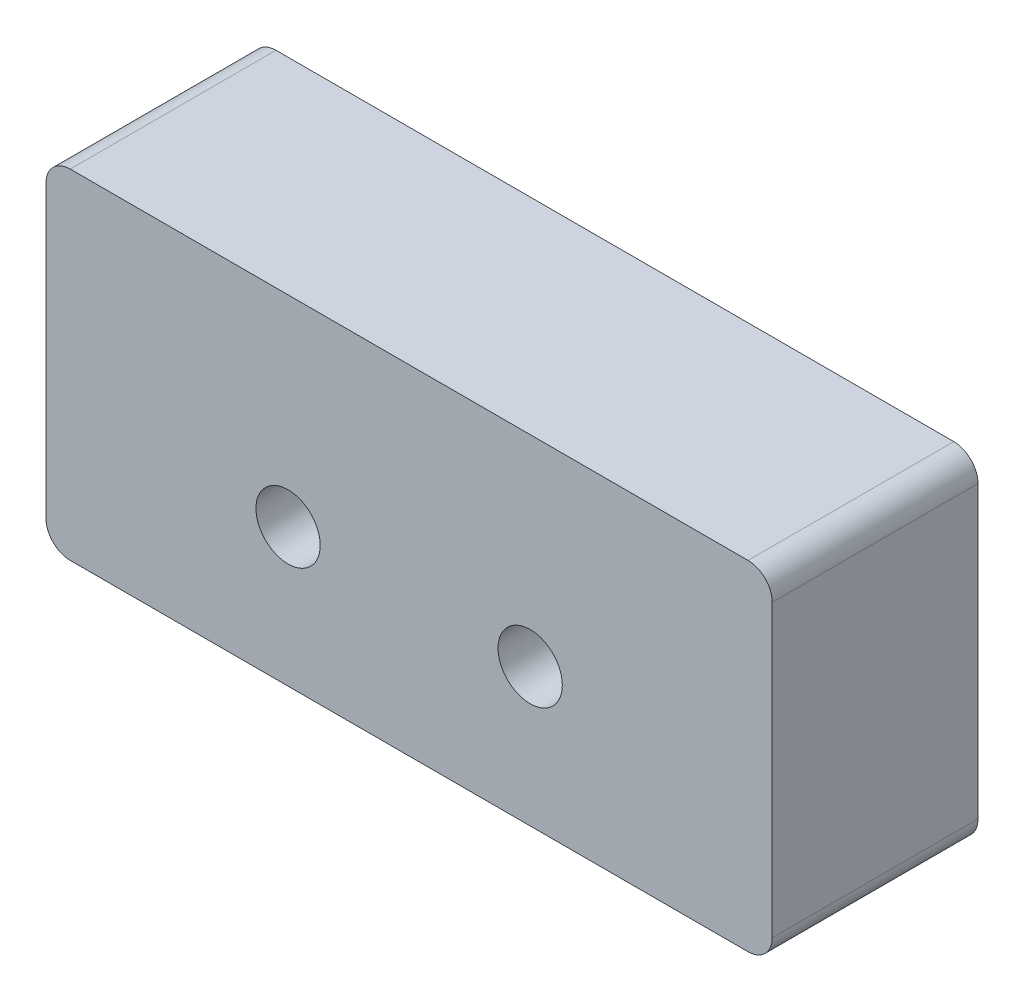
ISO-10303-21;
HEADER;
FILE_DESCRIPTION(('STEP AP214'),'2;1');
FILE_NAME('part.step','',(''),(''),'','','');
FILE_SCHEMA(('AUTOMOTIVE_DESIGN { 1 0 10303 214 1 1 1 1 }'));
ENDSEC;
DATA;
#1=APPLICATION_CONTEXT('core data for automotive mechanical design processes');
#2=APPLICATION_PROTOCOL_DEFINITION('international standard','automotive_design',2000,#1);
#3=PRODUCT_CONTEXT('',#1,'mechanical');
#4=PRODUCT('Part','Part','',(#3));
#5=PRODUCT_RELATED_PRODUCT_CATEGORY('part','',(#4));
#6=PRODUCT_DEFINITION_FORMATION('','',#4);
#7=PRODUCT_DEFINITION_CONTEXT('part definition',#1,'design');
#8=PRODUCT_DEFINITION('design','',#6,#7);
#9=PRODUCT_DEFINITION_SHAPE('','',#8);
#10=(LENGTH_UNIT() NAMED_UNIT(*) SI_UNIT(.MILLI.,.METRE.));
#11=(NAMED_UNIT(*) PLANE_ANGLE_UNIT() SI_UNIT($,.RADIAN.));
#12=(NAMED_UNIT(*) SI_UNIT($,.STERADIAN.) SOLID_ANGLE_UNIT());
#13=UNCERTAINTY_MEASURE_WITH_UNIT(LENGTH_MEASURE(1.E-05),#10,'distance_accuracy_value','');
#14=(GEOMETRIC_REPRESENTATION_CONTEXT(3) GLOBAL_UNCERTAINTY_ASSIGNED_CONTEXT((#13)) GLOBAL_UNIT_ASSIGNED_CONTEXT((#10,
#11,#12)) REPRESENTATION_CONTEXT('',''));
#15=CARTESIAN_POINT('',(0.,0.,0.));
#16=DIRECTION('',(0.,0.,1.));
#17=DIRECTION('',(1.,0.,0.));
#18=AXIS2_PLACEMENT_3D('',#15,#16,#17);
#19=CARTESIAN_POINT('',(0.,0.,21.59));
#20=DIRECTION('',(0.,0.,-1.));
#21=DIRECTION('',(-1.,0.,0.));
#22=AXIS2_PLACEMENT_3D('',#19,#20,#21);
#23=PLANE('',#22);
#24=DIRECTION('',(1.,0.,0.));
#25=VECTOR('',#24,1.);
#26=CARTESIAN_POINT('',(76.2,0.,21.59));
#27=LINE('',#26,#25);
#28=CARTESIAN_POINT('',(2.54000000000003,0.,21.59));
#29=VERTEX_POINT('',#28);
#30=CARTESIAN_POINT('',(73.66,0.,21.59));
#31=VERTEX_POINT('',#30);
#32=EDGE_CURVE('E162',#29,#31,#27,.T.);
#33=ORIENTED_EDGE('',*,*,#32,.T.);
#34=CARTESIAN_POINT('',(73.66,2.54,21.59));
#35=DIRECTION('',(0.,0.,-1.));
#36=DIRECTION('',(-1.,0.,0.));
#37=AXIS2_PLACEMENT_3D('',#34,#35,#36);
#38=CIRCLE('',#37,2.54);
#39=CARTESIAN_POINT('',(76.2,2.54,21.59));
#40=VERTEX_POINT('',#39);
#41=EDGE_CURVE('E181',#31,#40,#38,.F.);
#42=ORIENTED_EDGE('',*,*,#41,.T.);
#43=DIRECTION('',(0.,1.,0.));
#44=VECTOR('',#43,1.);
#45=CARTESIAN_POINT('',(76.2,35.56,21.59));
#46=LINE('',#45,#44);
#47=CARTESIAN_POINT('',(76.2,33.02,21.59));
#48=VERTEX_POINT('',#47);
#49=EDGE_CURVE('E137',#40,#48,#46,.T.);
#50=ORIENTED_EDGE('',*,*,#49,.T.);
#51=CARTESIAN_POINT('',(73.66,33.02,21.59));
#52=DIRECTION('',(0.,0.,-1.));
#53=DIRECTION('',(-1.,0.,0.));
#54=AXIS2_PLACEMENT_3D('',#51,#52,#53);
#55=CIRCLE('',#54,2.54);
#56=CARTESIAN_POINT('',(73.66,35.56,21.59));
#57=VERTEX_POINT('',#56);
#58=EDGE_CURVE('E176',#48,#57,#55,.F.);
#59=ORIENTED_EDGE('',*,*,#58,.T.);
#60=DIRECTION('',(-1.,0.,0.));
#61=VECTOR('',#60,1.);
#62=CARTESIAN_POINT('',(0.,35.56,21.59));
#63=LINE('',#62,#61);
#64=CARTESIAN_POINT('',(2.54,35.56,21.59));
#65=VERTEX_POINT('',#64);
#66=EDGE_CURVE('E194',#57,#65,#63,.T.);
#67=ORIENTED_EDGE('',*,*,#66,.T.);
#68=CARTESIAN_POINT('',(2.54,33.02,21.59));
#69=DIRECTION('',(0.,0.,-1.));
#70=DIRECTION('',(-1.,0.,0.));
#71=AXIS2_PLACEMENT_3D('',#68,#69,#70);
#72=CIRCLE('',#71,2.54);
#73=CARTESIAN_POINT('',(0.,33.02,21.59));
#74=VERTEX_POINT('',#73);
#75=EDGE_CURVE('E64',#65,#74,#72,.F.);
#76=ORIENTED_EDGE('',*,*,#75,.T.);
#77=DIRECTION('',(0.,-1.,0.));
#78=VECTOR('',#77,1.);
#79=CARTESIAN_POINT('',(0.,0.,21.59));
#80=LINE('',#79,#78);
#81=CARTESIAN_POINT('',(0.,2.54,21.59));
#82=VERTEX_POINT('',#81);
#83=EDGE_CURVE('E164',#74,#82,#80,.T.);
#84=ORIENTED_EDGE('',*,*,#83,.T.);
#85=CARTESIAN_POINT('',(2.54,2.54,21.59));
#86=DIRECTION('',(0.,0.,-1.));
#87=DIRECTION('',(-1.,0.,0.));
#88=AXIS2_PLACEMENT_3D('',#85,#86,#87);
#89=CIRCLE('',#88,2.54);
#90=EDGE_CURVE('E179',#82,#29,#89,.F.);
#91=ORIENTED_EDGE('',*,*,#90,.T.);
#92=EDGE_LOOP('',(#33,#42,#50,#59,#67,#76,#84,#91));
#93=FACE_BOUND('',#92,.T.);
#94=CARTESIAN_POINT('',(25.4,14.478,21.59));
#95=DIRECTION('',(0.,0.,1.));
#96=DIRECTION('',(1.,0.,0.));
#97=AXIS2_PLACEMENT_3D('',#94,#95,#96);
#98=CIRCLE('',#97,3.3734375);
#99=CARTESIAN_POINT('',(28.7734375,14.478,21.59));
#100=VERTEX_POINT('',#99);
#101=EDGE_CURVE('E156',#100,#100,#98,.T.);
#102=ORIENTED_EDGE('',*,*,#101,.F.);
#103=EDGE_LOOP('',(#102));
#104=FACE_BOUND('',#103,.T.);
#105=CARTESIAN_POINT('',(50.8,14.478,21.59));
#106=DIRECTION('',(0.,0.,1.));
#107=DIRECTION('',(1.,0.,0.));
#108=AXIS2_PLACEMENT_3D('',#105,#106,#107);
#109=CIRCLE('',#108,3.3734375);
#110=CARTESIAN_POINT('',(54.1734375,14.478,21.59));
#111=VERTEX_POINT('',#110);
#112=EDGE_CURVE('E221',#111,#111,#109,.T.);
#113=ORIENTED_EDGE('',*,*,#112,.F.);
#114=EDGE_LOOP('',(#113));
#115=FACE_BOUND('',#114,.T.);
#116=ADVANCED_FACE('F38',(#93,#104,#115),#23,.F.);
#117=CARTESIAN_POINT('',(0.,0.,0.));
#118=DIRECTION('',(0.,0.,-1.));
#119=DIRECTION('',(-1.,0.,0.));
#120=AXIS2_PLACEMENT_3D('',#117,#118,#119);
#121=PLANE('',#120);
#122=CARTESIAN_POINT('',(25.4,14.478,0.));
#123=DIRECTION('',(0.,0.,1.));
#124=DIRECTION('',(1.,0.,0.));
#125=AXIS2_PLACEMENT_3D('',#122,#123,#124);
#126=CIRCLE('',#125,3.3734375);
#127=CARTESIAN_POINT('',(28.7734375,14.478,0.));
#128=VERTEX_POINT('',#127);
#129=EDGE_CURVE('E217',#128,#128,#126,.T.);
#130=ORIENTED_EDGE('',*,*,#129,.T.);
#131=EDGE_LOOP('',(#130));
#132=FACE_BOUND('',#131,.T.);
#133=DIRECTION('',(0.,1.,0.));
#134=VECTOR('',#133,1.);
#135=CARTESIAN_POINT('',(76.2,35.56,0.));
#136=LINE('',#135,#134);
#137=CARTESIAN_POINT('',(76.2,2.54,0.));
#138=VERTEX_POINT('',#137);
#139=CARTESIAN_POINT('',(76.2,33.02,0.));
#140=VERTEX_POINT('',#139);
#141=EDGE_CURVE('E134',#138,#140,#136,.T.);
#142=ORIENTED_EDGE('',*,*,#141,.F.);
#143=CARTESIAN_POINT('',(73.66,2.54,0.));
#144=DIRECTION('',(0.,0.,-1.));
#145=DIRECTION('',(-1.,0.,0.));
#146=AXIS2_PLACEMENT_3D('',#143,#144,#145);
#147=CIRCLE('',#146,2.54);
#148=CARTESIAN_POINT('',(73.66,0.,0.));
#149=VERTEX_POINT('',#148);
#150=EDGE_CURVE('E116',#138,#149,#147,.T.);
#151=ORIENTED_EDGE('',*,*,#150,.T.);
#152=DIRECTION('',(1.,0.,0.));
#153=VECTOR('',#152,1.);
#154=CARTESIAN_POINT('',(76.2,0.,0.));
#155=LINE('',#154,#153);
#156=CARTESIAN_POINT('',(2.54000000000003,0.,0.));
#157=VERTEX_POINT('',#156);
#158=EDGE_CURVE('E148',#157,#149,#155,.T.);
#159=ORIENTED_EDGE('',*,*,#158,.F.);
#160=CARTESIAN_POINT('',(2.54,2.54,0.));
#161=DIRECTION('',(0.,0.,-1.));
#162=DIRECTION('',(-1.,0.,0.));
#163=AXIS2_PLACEMENT_3D('',#160,#161,#162);
#164=CIRCLE('',#163,2.54);
#165=CARTESIAN_POINT('',(0.,2.54,0.));
#166=VERTEX_POINT('',#165);
#167=EDGE_CURVE('E128',#157,#166,#164,.T.);
#168=ORIENTED_EDGE('',*,*,#167,.T.);
#169=DIRECTION('',(0.,-1.,0.));
#170=VECTOR('',#169,1.);
#171=CARTESIAN_POINT('',(0.,0.,0.));
#172=LINE('',#171,#170);
#173=CARTESIAN_POINT('',(0.,33.02,0.));
#174=VERTEX_POINT('',#173);
#175=EDGE_CURVE('E153',#174,#166,#172,.T.);
#176=ORIENTED_EDGE('',*,*,#175,.F.);
#177=CARTESIAN_POINT('',(2.54,33.02,0.));
#178=DIRECTION('',(0.,0.,-1.));
#179=DIRECTION('',(-1.,0.,0.));
#180=AXIS2_PLACEMENT_3D('',#177,#178,#179);
#181=CIRCLE('',#180,2.54);
#182=CARTESIAN_POINT('',(2.54,35.56,0.));
#183=VERTEX_POINT('',#182);
#184=EDGE_CURVE('E139',#174,#183,#181,.T.);
#185=ORIENTED_EDGE('',*,*,#184,.T.);
#186=DIRECTION('',(-1.,0.,0.));
#187=VECTOR('',#186,1.);
#188=CARTESIAN_POINT('',(0.,35.56,0.));
#189=LINE('',#188,#187);
#190=CARTESIAN_POINT('',(73.66,35.56,0.));
#191=VERTEX_POINT('',#190);
#192=EDGE_CURVE('E147',#191,#183,#189,.T.);
#193=ORIENTED_EDGE('',*,*,#192,.F.);
#194=CARTESIAN_POINT('',(73.66,33.02,0.));
#195=DIRECTION('',(0.,0.,-1.));
#196=DIRECTION('',(-1.,0.,0.));
#197=AXIS2_PLACEMENT_3D('',#194,#195,#196);
#198=CIRCLE('',#197,2.54);
#199=EDGE_CURVE('E145',#191,#140,#198,.T.);
#200=ORIENTED_EDGE('',*,*,#199,.T.);
#201=EDGE_LOOP('',(#142,#151,#159,#168,#176,#185,#193,#200));
#202=FACE_BOUND('',#201,.T.);
#203=CARTESIAN_POINT('',(50.8,14.478,0.));
#204=DIRECTION('',(0.,0.,1.));
#205=DIRECTION('',(1.,0.,0.));
#206=AXIS2_PLACEMENT_3D('',#203,#204,#205);
#207=CIRCLE('',#206,3.3734375);
#208=CARTESIAN_POINT('',(54.1734375,14.478,0.));
#209=VERTEX_POINT('',#208);
#210=EDGE_CURVE('E224',#209,#209,#207,.T.);
#211=ORIENTED_EDGE('',*,*,#210,.T.);
#212=EDGE_LOOP('',(#211));
#213=FACE_BOUND('',#212,.T.);
#214=ADVANCED_FACE('F142',(#132,#202,#213),#121,.T.);
#215=CARTESIAN_POINT('',(76.2,0.,21.59));
#216=DIRECTION('',(0.,1.,0.));
#217=DIRECTION('',(0.,0.,1.));
#218=AXIS2_PLACEMENT_3D('',#215,#216,#217);
#219=PLANE('',#218);
#220=ORIENTED_EDGE('',*,*,#158,.T.);
#221=DIRECTION('',(0.,0.,-1.));
#222=VECTOR('',#221,1.);
#223=CARTESIAN_POINT('',(73.66,0.,21.59));
#224=LINE('',#223,#222);
#225=EDGE_CURVE('E121',#149,#31,#224,.F.);
#226=ORIENTED_EDGE('',*,*,#225,.T.);
#227=ORIENTED_EDGE('',*,*,#32,.F.);
#228=DIRECTION('',(0.,0.,-1.));
#229=VECTOR('',#228,1.);
#230=CARTESIAN_POINT('',(2.54,0.,21.59));
#231=LINE('',#230,#229);
#232=EDGE_CURVE('E127',#29,#157,#231,.T.);
#233=ORIENTED_EDGE('',*,*,#232,.T.);
#234=EDGE_LOOP('',(#220,#226,#227,#233));
#235=FACE_BOUND('',#234,.T.);
#236=ADVANCED_FACE('F211',(#235),#219,.F.);
#237=CARTESIAN_POINT('',(76.2,35.56,21.59));
#238=DIRECTION('',(-1.,0.,0.));
#239=DIRECTION('',(0.,0.,1.));
#240=AXIS2_PLACEMENT_3D('',#237,#238,#239);
#241=PLANE('',#240);
#242=ORIENTED_EDGE('',*,*,#49,.F.);
#243=DIRECTION('',(0.,0.,-1.));
#244=VECTOR('',#243,1.);
#245=CARTESIAN_POINT('',(76.2,2.54,21.59));
#246=LINE('',#245,#244);
#247=EDGE_CURVE('E120',#40,#138,#246,.T.);
#248=ORIENTED_EDGE('',*,*,#247,.T.);
#249=ORIENTED_EDGE('',*,*,#141,.T.);
#250=DIRECTION('',(0.,0.,-1.));
#251=VECTOR('',#250,1.);
#252=CARTESIAN_POINT('',(76.2,33.02,21.59));
#253=LINE('',#252,#251);
#254=EDGE_CURVE('E140',#140,#48,#253,.F.);
#255=ORIENTED_EDGE('',*,*,#254,.T.);
#256=EDGE_LOOP('',(#242,#248,#249,#255));
#257=FACE_BOUND('',#256,.T.);
#258=ADVANCED_FACE('F133',(#257),#241,.F.);
#259=CARTESIAN_POINT('',(0.,35.56,21.59));
#260=DIRECTION('',(0.,-1.,0.));
#261=DIRECTION('',(0.,0.,-1.));
#262=AXIS2_PLACEMENT_3D('',#259,#260,#261);
#263=PLANE('',#262);
#264=ORIENTED_EDGE('',*,*,#66,.F.);
#265=DIRECTION('',(0.,0.,-1.));
#266=VECTOR('',#265,1.);
#267=CARTESIAN_POINT('',(73.66,35.56,21.59));
#268=LINE('',#267,#266);
#269=EDGE_CURVE('E11',#57,#191,#268,.T.);
#270=ORIENTED_EDGE('',*,*,#269,.T.);
#271=ORIENTED_EDGE('',*,*,#192,.T.);
#272=DIRECTION('',(0.,0.,-1.));
#273=VECTOR('',#272,1.);
#274=CARTESIAN_POINT('',(2.54,35.56,21.59));
#275=LINE('',#274,#273);
#276=EDGE_CURVE('E47',#183,#65,#275,.F.);
#277=ORIENTED_EDGE('',*,*,#276,.T.);
#278=EDGE_LOOP('',(#264,#270,#271,#277));
#279=FACE_BOUND('',#278,.T.);
#280=ADVANCED_FACE('F193',(#279),#263,.F.);
#281=CARTESIAN_POINT('',(0.,0.,21.59));
#282=DIRECTION('',(1.,0.,0.));
#283=DIRECTION('',(0.,0.,-1.));
#284=AXIS2_PLACEMENT_3D('',#281,#282,#283);
#285=PLANE('',#284);
#286=ORIENTED_EDGE('',*,*,#175,.T.);
#287=DIRECTION('',(0.,0.,-1.));
#288=VECTOR('',#287,1.);
#289=CARTESIAN_POINT('',(0.,2.54,21.59));
#290=LINE('',#289,#288);
#291=EDGE_CURVE('E54',#166,#82,#290,.F.);
#292=ORIENTED_EDGE('',*,*,#291,.T.);
#293=ORIENTED_EDGE('',*,*,#83,.F.);
#294=DIRECTION('',(0.,0.,-1.));
#295=VECTOR('',#294,1.);
#296=CARTESIAN_POINT('',(0.,33.02,21.59));
#297=LINE('',#296,#295);
#298=EDGE_CURVE('E183',#74,#174,#297,.T.);
#299=ORIENTED_EDGE('',*,*,#298,.T.);
#300=EDGE_LOOP('',(#286,#292,#293,#299));
#301=FACE_BOUND('',#300,.T.);
#302=ADVANCED_FACE('F204',(#301),#285,.F.);
#303=CARTESIAN_POINT('',(25.4,14.478,21.59));
#304=DIRECTION('',(0.,0.,-1.));
#305=DIRECTION('',(-1.,0.,0.));
#306=AXIS2_PLACEMENT_3D('',#303,#304,#305);
#307=CYLINDRICAL_SURFACE('',#306,3.3734375);
#308=ORIENTED_EDGE('',*,*,#101,.T.);
#309=EDGE_LOOP('',(#308));
#310=FACE_BOUND('',#309,.T.);
#311=ORIENTED_EDGE('',*,*,#129,.F.);
#312=EDGE_LOOP('',(#311));
#313=FACE_BOUND('',#312,.T.);
#314=ADVANCED_FACE('F243',(#310,#313),#307,.F.);
#315=CARTESIAN_POINT('',(50.8,14.478,21.59));
#316=DIRECTION('',(0.,0.,-1.));
#317=DIRECTION('',(-1.,0.,0.));
#318=AXIS2_PLACEMENT_3D('',#315,#316,#317);
#319=CYLINDRICAL_SURFACE('',#318,3.3734375);
#320=ORIENTED_EDGE('',*,*,#112,.T.);
#321=EDGE_LOOP('',(#320));
#322=FACE_BOUND('',#321,.T.);
#323=ORIENTED_EDGE('',*,*,#210,.F.);
#324=EDGE_LOOP('',(#323));
#325=FACE_BOUND('',#324,.T.);
#326=ADVANCED_FACE('F232',(#322,#325),#319,.F.);
#327=CARTESIAN_POINT('',(73.66,2.54,21.59));
#328=DIRECTION('',(0.,0.,-1.));
#329=DIRECTION('',(-1.,0.,0.));
#330=AXIS2_PLACEMENT_3D('',#327,#328,#329);
#331=CYLINDRICAL_SURFACE('',#330,2.54);
#332=ORIENTED_EDGE('',*,*,#41,.F.);
#333=ORIENTED_EDGE('',*,*,#225,.F.);
#334=ORIENTED_EDGE('',*,*,#150,.F.);
#335=ORIENTED_EDGE('',*,*,#247,.F.);
#336=EDGE_LOOP('',(#332,#333,#334,#335));
#337=FACE_BOUND('',#336,.T.);
#338=ADVANCED_FACE('F119',(#337),#331,.T.);
#339=CARTESIAN_POINT('',(2.54,2.54,21.59));
#340=DIRECTION('',(0.,0.,-1.));
#341=DIRECTION('',(-1.,0.,0.));
#342=AXIS2_PLACEMENT_3D('',#339,#340,#341);
#343=CYLINDRICAL_SURFACE('',#342,2.54);
#344=ORIENTED_EDGE('',*,*,#90,.F.);
#345=ORIENTED_EDGE('',*,*,#291,.F.);
#346=ORIENTED_EDGE('',*,*,#167,.F.);
#347=ORIENTED_EDGE('',*,*,#232,.F.);
#348=EDGE_LOOP('',(#344,#345,#346,#347));
#349=FACE_BOUND('',#348,.T.);
#350=ADVANCED_FACE('F208',(#349),#343,.T.);
#351=CARTESIAN_POINT('',(73.66,33.02,21.59));
#352=DIRECTION('',(0.,0.,-1.));
#353=DIRECTION('',(-1.,0.,0.));
#354=AXIS2_PLACEMENT_3D('',#351,#352,#353);
#355=CYLINDRICAL_SURFACE('',#354,2.54);
#356=ORIENTED_EDGE('',*,*,#58,.F.);
#357=ORIENTED_EDGE('',*,*,#254,.F.);
#358=ORIENTED_EDGE('',*,*,#199,.F.);
#359=ORIENTED_EDGE('',*,*,#269,.F.);
#360=EDGE_LOOP('',(#356,#357,#358,#359));
#361=FACE_BOUND('',#360,.T.);
#362=ADVANCED_FACE('F257',(#361),#355,.T.);
#363=CARTESIAN_POINT('',(2.54,33.02,21.59));
#364=DIRECTION('',(0.,0.,-1.));
#365=DIRECTION('',(-1.,0.,0.));
#366=AXIS2_PLACEMENT_3D('',#363,#364,#365);
#367=CYLINDRICAL_SURFACE('',#366,2.54);
#368=ORIENTED_EDGE('',*,*,#75,.F.);
#369=ORIENTED_EDGE('',*,*,#276,.F.);
#370=ORIENTED_EDGE('',*,*,#184,.F.);
#371=ORIENTED_EDGE('',*,*,#298,.F.);
#372=EDGE_LOOP('',(#368,#369,#370,#371));
#373=FACE_BOUND('',#372,.T.);
#374=ADVANCED_FACE('F40',(#373),#367,.T.);
#375=CLOSED_SHELL('',(#116,#214,#236,#258,#280,#302,#314,#326,#338,#350,#362,#374));
#376=MANIFOLD_SOLID_BREP('B2',#375);
#377=ADVANCED_BREP_SHAPE_REPRESENTATION('',(#18,#376),#14);
#378=SHAPE_DEFINITION_REPRESENTATION(#9,#377);
ENDSEC;
END-ISO-10303-21;
